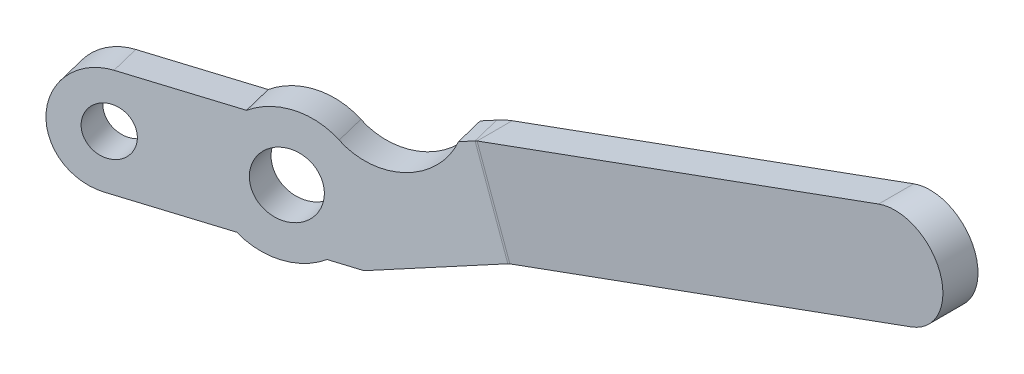
ISO-10303-21;
HEADER;
FILE_DESCRIPTION(('STEP AP214'),'2;1');
FILE_NAME('part.step','',(''),(''),'','','');
FILE_SCHEMA(('AUTOMOTIVE_DESIGN { 1 0 10303 214 1 1 1 1 }'));
ENDSEC;
DATA;
#1=APPLICATION_CONTEXT('core data for automotive mechanical design processes');
#2=APPLICATION_PROTOCOL_DEFINITION('international standard','automotive_design',2000,#1);
#3=PRODUCT_CONTEXT('',#1,'mechanical');
#4=PRODUCT('Part','Part','',(#3));
#5=PRODUCT_RELATED_PRODUCT_CATEGORY('part','',(#4));
#6=PRODUCT_DEFINITION_FORMATION('','',#4);
#7=PRODUCT_DEFINITION_CONTEXT('part definition',#1,'design');
#8=PRODUCT_DEFINITION('design','',#6,#7);
#9=PRODUCT_DEFINITION_SHAPE('','',#8);
#10=(LENGTH_UNIT() NAMED_UNIT(*) SI_UNIT(.MILLI.,.METRE.));
#11=(NAMED_UNIT(*) PLANE_ANGLE_UNIT() SI_UNIT($,.RADIAN.));
#12=(NAMED_UNIT(*) SI_UNIT($,.STERADIAN.) SOLID_ANGLE_UNIT());
#13=UNCERTAINTY_MEASURE_WITH_UNIT(LENGTH_MEASURE(1.E-05),#10,'distance_accuracy_value','');
#14=(GEOMETRIC_REPRESENTATION_CONTEXT(3) GLOBAL_UNCERTAINTY_ASSIGNED_CONTEXT((#13)) GLOBAL_UNIT_ASSIGNED_CONTEXT((#10,
#11,#12)) REPRESENTATION_CONTEXT('',''));
#15=CARTESIAN_POINT('',(0.,0.,0.));
#16=DIRECTION('',(0.,0.,1.));
#17=DIRECTION('',(1.,0.,0.));
#18=AXIS2_PLACEMENT_3D('',#15,#16,#17);
#19=CARTESIAN_POINT('',(16.9303405636724,10.0535875037622,-3.80139693251965));
#20=DIRECTION('',(-0.342020143325667,0.939692620785909,0.));
#21=DIRECTION('',(-0.883022221559487,-0.321393804843274,0.34202014332567));
#22=AXIS2_PLACEMENT_3D('',#19,#20,#21);
#23=PLANE('',#22);
#24=DIRECTION('',(-0.883022221559487,-0.321393804843274,0.34202014332567));
#25=VECTOR('',#24,1.);
#26=CARTESIAN_POINT('',(18.4601750747264,10.610401729139,0.671539942421267));
#27=LINE('',#26,#25);
#28=CARTESIAN_POINT('',(20.0792572328434,11.199699441525,0.0444224155291021));
#29=VERTEX_POINT('',#28);
#30=CARTESIAN_POINT('',(18.4601750747264,10.610401729139,0.671539942421267));
#31=VERTEX_POINT('',#30);
#32=EDGE_CURVE('E64',#29,#31,#27,.T.);
#33=ORIENTED_EDGE('',*,*,#32,.F.);
#34=DIRECTION('',(-0.321393804843275,-0.116977778440493,-0.939692620785909));
#35=VECTOR('',#34,1.);
#36=CARTESIAN_POINT('',(18.5494227217894,10.6428852161483,-4.42851445941182));
#37=LINE('',#36,#35);
#38=CARTESIAN_POINT('',(18.5494227217894,10.6428852161483,-4.42851445941182));
#39=VERTEX_POINT('',#38);
#40=EDGE_CURVE('E141',#29,#39,#37,.T.);
#41=ORIENTED_EDGE('',*,*,#40,.T.);
#42=DIRECTION('',(-0.883022221559487,-0.321393804843274,0.34202014332567));
#43=VECTOR('',#42,1.);
#44=CARTESIAN_POINT('',(16.9303405636724,10.0535875037622,-3.80139693251965));
#45=LINE('',#44,#43);
#46=CARTESIAN_POINT('',(16.9303405636724,10.0535875037622,-3.80139693251965));
#47=VERTEX_POINT('',#46);
#48=EDGE_CURVE('E44',#39,#47,#45,.T.);
#49=ORIENTED_EDGE('',*,*,#48,.T.);
#50=DIRECTION('',(0.321393804843277,0.116977778440494,0.939692620785908));
#51=VECTOR('',#50,1.);
#52=CARTESIAN_POINT('',(16.9303405636724,10.0535875037622,-3.80139693251965));
#53=LINE('',#52,#51);
#54=EDGE_CURVE('E269',#47,#31,#53,.T.);
#55=ORIENTED_EDGE('',*,*,#54,.T.);
#56=EDGE_LOOP('',(#33,#41,#49,#55));
#57=FACE_BOUND('',#56,.T.);
#58=ADVANCED_FACE('F40',(#57),#23,.T.);
#59=CARTESIAN_POINT('',(8.93069721890043,-6.69235560066744,1.01926349836034));
#60=DIRECTION('',(0.342020143325667,-0.939692620785909,0.));
#61=DIRECTION('',(0.883022221559487,0.321393804843274,-0.34202014332567));
#62=AXIS2_PLACEMENT_3D('',#59,#60,#61);
#63=PLANE('',#62);
#64=DIRECTION('',(0.883022221559487,0.321393804843274,-0.34202014332567));
#65=VECTOR('',#64,1.);
#66=CARTESIAN_POINT('',(8.93069721890043,-6.69235560066744,1.01926349836034));
#67=LINE('',#66,#65);
#68=CARTESIAN_POINT('',(8.93069721890043,-6.69235560066744,1.01926349836034));
#69=VERTEX_POINT('',#68);
#70=CARTESIAN_POINT('',(22.9956845850224,-1.57311885406876,-4.42851445941182));
#71=VERTEX_POINT('',#70);
#72=EDGE_CURVE('E160',#69,#71,#67,.T.);
#73=ORIENTED_EDGE('',*,*,#72,.T.);
#74=DIRECTION('',(0.321393804843275,0.116977778440493,0.939692620785909));
#75=VECTOR('',#74,1.);
#76=CARTESIAN_POINT('',(22.9956845850224,-1.57311885406875,-4.42851445941179));
#77=LINE('',#76,#75);
#78=CARTESIAN_POINT('',(24.5255190960764,-1.01630462869201,0.044422415529103));
#79=VERTEX_POINT('',#78);
#80=EDGE_CURVE('E12',#71,#79,#77,.T.);
#81=ORIENTED_EDGE('',*,*,#80,.T.);
#82=DIRECTION('',(0.883022221559487,0.321393804843274,-0.34202014332567));
#83=VECTOR('',#82,1.);
#84=CARTESIAN_POINT('',(10.4605317299544,-6.13554137529069,5.49220037330126));
#85=LINE('',#84,#83);
#86=CARTESIAN_POINT('',(10.4605317299544,-6.13554137529069,5.49220037330126));
#87=VERTEX_POINT('',#86);
#88=EDGE_CURVE('E57',#87,#79,#85,.T.);
#89=ORIENTED_EDGE('',*,*,#88,.F.);
#90=DIRECTION('',(0.321393804843277,0.116977778440494,0.939692620785908));
#91=VECTOR('',#90,1.);
#92=CARTESIAN_POINT('',(8.93069721890043,-6.69235560066744,1.01926349836034));
#93=LINE('',#92,#91);
#94=EDGE_CURVE('E271',#69,#87,#93,.T.);
#95=ORIENTED_EDGE('',*,*,#94,.F.);
#96=EDGE_LOOP('',(#73,#81,#89,#95));
#97=FACE_BOUND('',#96,.T.);
#98=ADVANCED_FACE('F42',(#97),#63,.T.);
#99=CARTESIAN_POINT('',(-15.9636675172793,1.10513464504574,13.6284521343767));
#100=DIRECTION('',(0.321393804843277,0.116977778440494,0.939692620785908));
#101=DIRECTION('',(0.94674724402994,-0.0193824180657404,-0.321393804843277));
#102=AXIS2_PLACEMENT_3D('',#99,#100,#101);
#103=PLANE('',#102);
#104=CARTESIAN_POINT('',(2.02453011928954,0.736868701796673,7.52196984235449));
#105=DIRECTION('',(0.321393804843277,0.116977778440494,0.939692620785908));
#106=DIRECTION('',(0.94674724402994,-0.0193824180657404,-0.321393804843277));
#107=AXIS2_PLACEMENT_3D('',#104,#105,#106);
#108=CIRCLE('',#107,4.);
#109=CARTESIAN_POINT('',(5.8115190954093,0.659339029533711,6.23639462298139));
#110=VERTEX_POINT('',#109);
#111=EDGE_CURVE('E190',#110,#110,#108,.T.);
#112=ORIENTED_EDGE('',*,*,#111,.F.);
#113=EDGE_LOOP('',(#112));
#114=FACE_BOUND('',#113,.T.);
#115=CARTESIAN_POINT('',(-15.9636675172793,1.10513464504574,13.6284521343767));
#116=DIRECTION('',(0.321393804843277,0.116977778440494,0.939692620785908));
#117=DIRECTION('',(0.94674724402994,-0.0193824180657404,-0.321393804843277));
#118=AXIS2_PLACEMENT_3D('',#115,#116,#117);
#119=CIRCLE('',#118,3.);
#120=CARTESIAN_POINT('',(-13.1234257851895,1.04698739084852,12.6642707198469));
#121=VERTEX_POINT('',#120);
#122=EDGE_CURVE('E216',#121,#121,#119,.T.);
#123=ORIENTED_EDGE('',*,*,#122,.F.);
#124=EDGE_LOOP('',(#123));
#125=FACE_BOUND('',#124,.T.);
#126=ORIENTED_EDGE('',*,*,#88,.T.);
#127=DIRECTION('',(-0.342020143325619,0.939692620785927,0.));
#128=VECTOR('',#127,1.);
#129=CARTESIAN_POINT('',(19.1073665552538,13.8699471323814,0.0444224155291047));
#130=LINE('',#129,#128);
#131=EDGE_CURVE('E49',#79,#29,#130,.T.);
#132=ORIENTED_EDGE('',*,*,#131,.T.);
#133=ORIENTED_EDGE('',*,*,#32,.T.);
#134=CARTESIAN_POINT('',(11.2425108575783,13.324299739666,2.80228648693524));
#135=DIRECTION('',(-0.321393804843277,-0.116977778440494,-0.939692620785908));
#136=DIRECTION('',(0.94674724402994,-0.0193824180657404,-0.321393804843277));
#137=AXIS2_PLACEMENT_3D('',#134,#135,#136);
#138=CIRCLE('',#137,8.);
#139=CARTESIAN_POINT('',(6.71834853203782,7.14641947568104,5.11869549572997));
#140=VERTEX_POINT('',#139);
#141=EDGE_CURVE('E256',#31,#140,#138,.T.);
#142=ORIENTED_EDGE('',*,*,#141,.T.);
#143=CARTESIAN_POINT('',(2.02453011928954,0.736868701796673,7.52196984235449));
#144=DIRECTION('',(0.321393804843277,0.116977778440494,0.939692620785908));
#145=DIRECTION('',(0.94674724402994,-0.0193824180657404,-0.321393804843277));
#146=AXIS2_PLACEMENT_3D('',#143,#144,#145);
#147=CIRCLE('',#146,8.3);
#148=CARTESIAN_POINT('',(-2.6789531795147,7.53286426506875,8.28465533576305));
#149=VERTEX_POINT('',#148);
#150=EDGE_CURVE('E259',#140,#149,#147,.T.);
#151=ORIENTED_EDGE('',*,*,#150,.T.);
#152=DIRECTION('',(-0.94674724402994,0.0193824180657404,0.321393804843277));
#153=VECTOR('',#152,1.);
#154=CARTESIAN_POINT('',(-16.0944988392231,7.80751593814853,12.8388521299034));
#155=LINE('',#154,#153);
#156=CARTESIAN_POINT('',(-16.0944988392231,7.80751593814853,12.8388521299034));
#157=VERTEX_POINT('',#156);
#158=EDGE_CURVE('E229',#149,#157,#155,.T.);
#159=ORIENTED_EDGE('',*,*,#158,.T.);
#160=CARTESIAN_POINT('',(-15.9636675172793,1.10513464504574,13.6284521343767));
#161=DIRECTION('',(0.321393804843277,0.116977778440494,0.939692620785908));
#162=DIRECTION('',(0.94674724402994,-0.0193824180657404,-0.321393804843277));
#163=AXIS2_PLACEMENT_3D('',#160,#161,#162);
#164=CIRCLE('',#163,6.75);
#165=CARTESIAN_POINT('',(-15.8328361953356,-5.59724664805705,14.4180521388501));
#166=VERTEX_POINT('',#165);
#167=EDGE_CURVE('E222',#157,#166,#164,.T.);
#168=ORIENTED_EDGE('',*,*,#167,.T.);
#169=DIRECTION('',(0.94674724402994,-0.0193824180657404,-0.321393804843277));
#170=VECTOR('',#169,1.);
#171=CARTESIAN_POINT('',(-15.8328361953356,-5.59724664805705,14.4180521388501));
#172=LINE('',#171,#170);
#173=CARTESIAN_POINT('',(-2.41729053562721,-5.87189832113683,9.86385534470972));
#174=VERTEX_POINT('',#173);
#175=EDGE_CURVE('E248',#166,#174,#172,.T.);
#176=ORIENTED_EDGE('',*,*,#175,.T.);
#177=CARTESIAN_POINT('',(2.02453011928954,0.736868701796673,7.52196984235449));
#178=DIRECTION('',(0.321393804843277,0.116977778440494,0.939692620785908));
#179=DIRECTION('',(0.94674724402994,-0.0193824180657404,-0.321393804843277));
#180=AXIS2_PLACEMENT_3D('',#177,#178,#179);
#181=CIRCLE('',#180,8.3);
#182=CARTESIAN_POINT('',(6.72801341809379,-6.0591268614754,6.75928434894593));
#183=VERTEX_POINT('',#182);
#184=EDGE_CURVE('E251',#174,#183,#181,.T.);
#185=ORIENTED_EDGE('',*,*,#184,.T.);
#186=DIRECTION('',(0.94674724402994,-0.0193824180657402,-0.321393804843277));
#187=VECTOR('',#186,1.);
#188=CARTESIAN_POINT('',(6.72801341809379,-6.0591268614754,6.75928434894593));
#189=LINE('',#188,#187);
#190=EDGE_CURVE('E254',#183,#87,#189,.T.);
#191=ORIENTED_EDGE('',*,*,#190,.T.);
#192=EDGE_LOOP('',(#126,#132,#133,#142,#151,#159,#168,#176,#185,#191));
#193=FACE_BOUND('',#192,.T.);
#194=ADVANCED_FACE('F280',(#114,#125,#193),#103,.T.);
#195=CARTESIAN_POINT('',(-17.4935020283333,0.54832041966899,9.15551525943583));
#196=DIRECTION('',(0.321393804843277,0.116977778440494,0.939692620785908));
#197=DIRECTION('',(0.94674724402994,-0.0193824180657404,-0.321393804843277));
#198=AXIS2_PLACEMENT_3D('',#195,#196,#197);
#199=CYLINDRICAL_SURFACE('',#198,6.75);
#200=ORIENTED_EDGE('',*,*,#167,.F.);
#201=DIRECTION('',(0.321393804843277,0.116977778440494,0.939692620785908));
#202=VECTOR('',#201,1.);
#203=CARTESIAN_POINT('',(-17.6243333502771,7.25070171277178,8.36591525496249));
#204=LINE('',#203,#202);
#205=CARTESIAN_POINT('',(-17.6243333502771,7.25070171277178,8.36591525496249));
#206=VERTEX_POINT('',#205);
#207=EDGE_CURVE('E169',#206,#157,#204,.T.);
#208=ORIENTED_EDGE('',*,*,#207,.F.);
#209=CARTESIAN_POINT('',(-17.4935020283333,0.54832041966899,9.15551525943583));
#210=DIRECTION('',(0.321393804843277,0.116977778440494,0.939692620785908));
#211=DIRECTION('',(0.94674724402994,-0.0193824180657404,-0.321393804843277));
#212=AXIS2_PLACEMENT_3D('',#209,#210,#211);
#213=CIRCLE('',#212,6.75);
#214=CARTESIAN_POINT('',(-17.3626707063896,-6.1540608734338,9.94511526390916));
#215=VERTEX_POINT('',#214);
#216=EDGE_CURVE('E225',#206,#215,#213,.T.);
#217=ORIENTED_EDGE('',*,*,#216,.T.);
#218=DIRECTION('',(0.321393804843277,0.116977778440494,0.939692620785908));
#219=VECTOR('',#218,1.);
#220=CARTESIAN_POINT('',(-17.3626707063896,-6.1540608734338,9.94511526390916));
#221=LINE('',#220,#219);
#222=EDGE_CURVE('E245',#215,#166,#221,.T.);
#223=ORIENTED_EDGE('',*,*,#222,.T.);
#224=EDGE_LOOP('',(#200,#208,#217,#223));
#225=FACE_BOUND('',#224,.T.);
#226=ADVANCED_FACE('F295',(#225),#199,.T.);
#227=CARTESIAN_POINT('',(-17.6243333502771,7.25070171277178,8.36591525496249));
#228=DIRECTION('',(-0.0193824180657404,0.992945376755968,-0.116977778440494));
#229=DIRECTION('',(0.321393804843277,0.116977778440494,0.939692620785908));
#230=AXIS2_PLACEMENT_3D('',#227,#228,#229);
#231=PLANE('',#230);
#232=ORIENTED_EDGE('',*,*,#158,.F.);
#233=DIRECTION('',(0.321393804843277,0.116977778440494,0.939692620785908));
#234=VECTOR('',#233,1.);
#235=CARTESIAN_POINT('',(-4.2087876905687,6.97605003969199,3.81171846082213));
#236=LINE('',#235,#234);
#237=CARTESIAN_POINT('',(-4.2087876905687,6.97605003969199,3.81171846082213));
#238=VERTEX_POINT('',#237);
#239=EDGE_CURVE('E265',#238,#149,#236,.T.);
#240=ORIENTED_EDGE('',*,*,#239,.F.);
#241=DIRECTION('',(-0.94674724402994,0.0193824180657404,0.321393804843277));
#242=VECTOR('',#241,1.);
#243=CARTESIAN_POINT('',(-17.6243333502771,7.25070171277178,8.36591525496249));
#244=LINE('',#243,#242);
#245=EDGE_CURVE('E242',#238,#206,#244,.T.);
#246=ORIENTED_EDGE('',*,*,#245,.T.);
#247=ORIENTED_EDGE('',*,*,#207,.T.);
#248=EDGE_LOOP('',(#232,#240,#246,#247));
#249=FACE_BOUND('',#248,.T.);
#250=ADVANCED_FACE('F290',(#249),#231,.T.);
#251=CARTESIAN_POINT('',(0.494695608235544,0.180054476419921,3.04903296741357));
#252=DIRECTION('',(0.321393804843277,0.116977778440494,0.939692620785908));
#253=DIRECTION('',(0.94674724402994,-0.0193824180657404,-0.321393804843277));
#254=AXIS2_PLACEMENT_3D('',#251,#252,#253);
#255=CYLINDRICAL_SURFACE('',#254,8.3);
#256=ORIENTED_EDGE('',*,*,#150,.F.);
#257=DIRECTION('',(0.321393804843277,0.116977778440494,0.939692620785908));
#258=VECTOR('',#257,1.);
#259=CARTESIAN_POINT('',(5.18851402098382,6.58960525030429,0.645758620789045));
#260=LINE('',#259,#258);
#261=CARTESIAN_POINT('',(5.18851402098382,6.58960525030429,0.645758620789045));
#262=VERTEX_POINT('',#261);
#263=EDGE_CURVE('E267',#262,#140,#260,.T.);
#264=ORIENTED_EDGE('',*,*,#263,.F.);
#265=CARTESIAN_POINT('',(0.494695608235544,0.180054476419921,3.04903296741357));
#266=DIRECTION('',(0.321393804843277,0.116977778440494,0.939692620785908));
#267=DIRECTION('',(0.94674724402994,-0.0193824180657404,-0.321393804843277));
#268=AXIS2_PLACEMENT_3D('',#265,#266,#267);
#269=CIRCLE('',#268,8.3);
#270=EDGE_CURVE('E239',#262,#238,#269,.T.);
#271=ORIENTED_EDGE('',*,*,#270,.T.);
#272=ORIENTED_EDGE('',*,*,#239,.T.);
#273=EDGE_LOOP('',(#256,#264,#271,#272));
#274=FACE_BOUND('',#273,.T.);
#275=ADVANCED_FACE('F287',(#274),#255,.T.);
#276=CARTESIAN_POINT('',(9.71267634652434,12.7674855142892,-1.67065038800568));
#277=DIRECTION('',(0.321393804843277,0.116977778440494,0.939692620785908));
#278=DIRECTION('',(0.94674724402994,-0.0193824180657404,-0.321393804843277));
#279=AXIS2_PLACEMENT_3D('',#276,#277,#278);
#280=CYLINDRICAL_SURFACE('',#279,8.);
#281=ORIENTED_EDGE('',*,*,#141,.F.);
#282=ORIENTED_EDGE('',*,*,#54,.F.);
#283=CARTESIAN_POINT('',(9.71267634652434,12.7674855142892,-1.67065038800568));
#284=DIRECTION('',(-0.321393804843277,-0.116977778440494,-0.939692620785908));
#285=DIRECTION('',(0.94674724402994,-0.0193824180657404,-0.321393804843277));
#286=AXIS2_PLACEMENT_3D('',#283,#284,#285);
#287=CIRCLE('',#286,8.);
#288=EDGE_CURVE('E159',#47,#262,#287,.T.);
#289=ORIENTED_EDGE('',*,*,#288,.T.);
#290=ORIENTED_EDGE('',*,*,#263,.T.);
#291=EDGE_LOOP('',(#281,#282,#289,#290));
#292=FACE_BOUND('',#291,.T.);
#293=ADVANCED_FACE('F284',(#292),#280,.F.);
#294=CARTESIAN_POINT('',(5.19817890703979,-6.61594108685215,2.28634747400501));
#295=DIRECTION('',(0.0193824180657407,-0.992945376755968,0.116977778440494));
#296=DIRECTION('',(0.94674724402994,-0.0193824180657402,-0.321393804843277));
#297=AXIS2_PLACEMENT_3D('',#294,#295,#296);
#298=PLANE('',#297);
#299=ORIENTED_EDGE('',*,*,#190,.F.);
#300=DIRECTION('',(0.321393804843277,0.116977778440494,0.939692620785908));
#301=VECTOR('',#300,1.);
#302=CARTESIAN_POINT('',(5.19817890703979,-6.61594108685215,2.28634747400501));
#303=LINE('',#302,#301);
#304=CARTESIAN_POINT('',(5.19817890703979,-6.61594108685215,2.28634747400501));
#305=VERTEX_POINT('',#304);
#306=EDGE_CURVE('E273',#305,#183,#303,.T.);
#307=ORIENTED_EDGE('',*,*,#306,.F.);
#308=DIRECTION('',(0.94674724402994,-0.0193824180657402,-0.321393804843277));
#309=VECTOR('',#308,1.);
#310=CARTESIAN_POINT('',(5.19817890703979,-6.61594108685215,2.28634747400501));
#311=LINE('',#310,#309);
#312=EDGE_CURVE('E235',#305,#69,#311,.T.);
#313=ORIENTED_EDGE('',*,*,#312,.T.);
#314=ORIENTED_EDGE('',*,*,#94,.T.);
#315=EDGE_LOOP('',(#299,#307,#313,#314));
#316=FACE_BOUND('',#315,.T.);
#317=ADVANCED_FACE('F307',(#316),#298,.T.);
#318=CARTESIAN_POINT('',(0.494695608235544,0.180054476419921,3.04903296741357));
#319=DIRECTION('',(0.321393804843277,0.116977778440494,0.939692620785908));
#320=DIRECTION('',(0.94674724402994,-0.0193824180657404,-0.321393804843277));
#321=AXIS2_PLACEMENT_3D('',#318,#319,#320);
#322=CYLINDRICAL_SURFACE('',#321,8.3);
#323=ORIENTED_EDGE('',*,*,#184,.F.);
#324=DIRECTION('',(0.321393804843277,0.116977778440494,0.939692620785908));
#325=VECTOR('',#324,1.);
#326=CARTESIAN_POINT('',(-3.94712504668121,-6.42871254651358,5.3909184697688));
#327=LINE('',#326,#325);
#328=CARTESIAN_POINT('',(-3.94712504668121,-6.42871254651358,5.3909184697688));
#329=VERTEX_POINT('',#328);
#330=EDGE_CURVE('E275',#329,#174,#327,.T.);
#331=ORIENTED_EDGE('',*,*,#330,.F.);
#332=CARTESIAN_POINT('',(0.494695608235544,0.180054476419921,3.04903296741357));
#333=DIRECTION('',(0.321393804843277,0.116977778440494,0.939692620785908));
#334=DIRECTION('',(0.94674724402994,-0.0193824180657404,-0.321393804843277));
#335=AXIS2_PLACEMENT_3D('',#332,#333,#334);
#336=CIRCLE('',#335,8.3);
#337=EDGE_CURVE('E232',#329,#305,#336,.T.);
#338=ORIENTED_EDGE('',*,*,#337,.T.);
#339=ORIENTED_EDGE('',*,*,#306,.T.);
#340=EDGE_LOOP('',(#323,#331,#338,#339));
#341=FACE_BOUND('',#340,.T.);
#342=ADVANCED_FACE('F303',(#341),#322,.T.);
#343=CARTESIAN_POINT('',(-17.3626707063896,-6.1540608734338,9.94511526390916));
#344=DIRECTION('',(0.0193824180657404,-0.992945376755968,0.116977778440494));
#345=DIRECTION('',(-0.321393804843277,-0.116977778440494,-0.939692620785908));
#346=AXIS2_PLACEMENT_3D('',#343,#344,#345);
#347=PLANE('',#346);
#348=ORIENTED_EDGE('',*,*,#175,.F.);
#349=ORIENTED_EDGE('',*,*,#222,.F.);
#350=DIRECTION('',(0.94674724402994,-0.0193824180657404,-0.321393804843277));
#351=VECTOR('',#350,1.);
#352=CARTESIAN_POINT('',(-17.3626707063896,-6.1540608734338,9.94511526390916));
#353=LINE('',#352,#351);
#354=EDGE_CURVE('E228',#215,#329,#353,.T.);
#355=ORIENTED_EDGE('',*,*,#354,.T.);
#356=ORIENTED_EDGE('',*,*,#330,.T.);
#357=EDGE_LOOP('',(#348,#349,#355,#356));
#358=FACE_BOUND('',#357,.T.);
#359=ADVANCED_FACE('F299',(#358),#347,.T.);
#360=CARTESIAN_POINT('',(-17.4935020283333,0.54832041966899,9.15551525943583));
#361=DIRECTION('',(0.321393804843277,0.116977778440494,0.939692620785908));
#362=DIRECTION('',(0.94674724402994,-0.0193824180657404,-0.321393804843277));
#363=AXIS2_PLACEMENT_3D('',#360,#361,#362);
#364=PLANE('',#363);
#365=DIRECTION('',(-0.342020143325619,0.939692620785927,0.));
#366=VECTOR('',#365,1.);
#367=CARTESIAN_POINT('',(17.5775320441998,13.3131329070047,-4.42851445941182));
#368=LINE('',#367,#366);
#369=EDGE_CURVE('E148',#71,#39,#368,.T.);
#370=ORIENTED_EDGE('',*,*,#369,.F.);
#371=ORIENTED_EDGE('',*,*,#72,.F.);
#372=ORIENTED_EDGE('',*,*,#312,.F.);
#373=ORIENTED_EDGE('',*,*,#337,.F.);
#374=ORIENTED_EDGE('',*,*,#354,.F.);
#375=ORIENTED_EDGE('',*,*,#216,.F.);
#376=ORIENTED_EDGE('',*,*,#245,.F.);
#377=ORIENTED_EDGE('',*,*,#270,.F.);
#378=ORIENTED_EDGE('',*,*,#288,.F.);
#379=ORIENTED_EDGE('',*,*,#48,.F.);
#380=EDGE_LOOP('',(#370,#371,#372,#373,#374,#375,#376,#377,#378,#379));
#381=FACE_BOUND('',#380,.T.);
#382=CARTESIAN_POINT('',(0.494695608235544,0.180054476419921,3.04903296741357));
#383=DIRECTION('',(0.321393804843277,0.116977778440494,0.939692620785908));
#384=DIRECTION('',(0.94674724402994,-0.0193824180657404,-0.321393804843277));
#385=AXIS2_PLACEMENT_3D('',#382,#383,#384);
#386=CIRCLE('',#385,4.);
#387=CARTESIAN_POINT('',(4.2816845843553,0.102524804156959,1.76345774804046));
#388=VERTEX_POINT('',#387);
#389=EDGE_CURVE('E213',#388,#388,#386,.T.);
#390=ORIENTED_EDGE('',*,*,#389,.T.);
#391=EDGE_LOOP('',(#390));
#392=FACE_BOUND('',#391,.T.);
#393=CARTESIAN_POINT('',(-17.4935020283333,0.54832041966899,9.15551525943583));
#394=DIRECTION('',(0.321393804843277,0.116977778440494,0.939692620785908));
#395=DIRECTION('',(0.94674724402994,-0.0193824180657404,-0.321393804843277));
#396=AXIS2_PLACEMENT_3D('',#393,#394,#395);
#397=CIRCLE('',#396,3.);
#398=CARTESIAN_POINT('',(-14.6532602962435,0.490173165471768,8.191333844906));
#399=VERTEX_POINT('',#398);
#400=EDGE_CURVE('E219',#399,#399,#397,.T.);
#401=ORIENTED_EDGE('',*,*,#400,.T.);
#402=EDGE_LOOP('',(#401));
#403=FACE_BOUND('',#402,.T.);
#404=ADVANCED_FACE('F153',(#381,#392,#403),#364,.F.);
#405=CARTESIAN_POINT('',(-17.4935020283333,0.54832041966899,9.15551525943583));
#406=DIRECTION('',(0.321393804843277,0.116977778440494,0.939692620785908));
#407=DIRECTION('',(0.94674724402994,-0.0193824180657404,-0.321393804843277));
#408=AXIS2_PLACEMENT_3D('',#405,#406,#407);
#409=CYLINDRICAL_SURFACE('',#408,3.);
#410=ORIENTED_EDGE('',*,*,#400,.F.);
#411=EDGE_LOOP('',(#410));
#412=FACE_BOUND('',#411,.T.);
#413=ORIENTED_EDGE('',*,*,#122,.T.);
#414=EDGE_LOOP('',(#413));
#415=FACE_BOUND('',#414,.T.);
#416=ADVANCED_FACE('F340',(#412,#415),#409,.F.);
#417=CARTESIAN_POINT('',(0.494695608235544,0.180054476419921,3.04903296741357));
#418=DIRECTION('',(0.321393804843277,0.116977778440494,0.939692620785908));
#419=DIRECTION('',(0.94674724402994,-0.0193824180657404,-0.321393804843277));
#420=AXIS2_PLACEMENT_3D('',#417,#418,#419);
#421=CYLINDRICAL_SURFACE('',#420,4.);
#422=ORIENTED_EDGE('',*,*,#389,.F.);
#423=EDGE_LOOP('',(#422));
#424=FACE_BOUND('',#423,.T.);
#425=ORIENTED_EDGE('',*,*,#111,.T.);
#426=EDGE_LOOP('',(#425));
#427=FACE_BOUND('',#426,.T.);
#428=ADVANCED_FACE('F333',(#424,#427),#421,.F.);
#429=CARTESIAN_POINT('',(77.,25.,-4.76));
#430=DIRECTION('',(0.,0.,1.));
#431=DIRECTION('',(1.,0.,0.));
#432=AXIS2_PLACEMENT_3D('',#429,#430,#431);
#433=CYLINDRICAL_SURFACE('',#432,6.5);
#434=CARTESIAN_POINT('',(77.,25.,0.));
#435=DIRECTION('',(0.,0.,1.));
#436=DIRECTION('',(1.,0.,0.));
#437=AXIS2_PLACEMENT_3D('',#434,#435,#436);
#438=CIRCLE('',#437,6.5);
#439=CARTESIAN_POINT('',(79.2231309316169,18.8919979648916,0.));
#440=VERTEX_POINT('',#439);
#441=CARTESIAN_POINT('',(74.7768690683831,31.1080020351084,0.));
#442=VERTEX_POINT('',#441);
#443=EDGE_CURVE('E195',#440,#442,#438,.T.);
#444=ORIENTED_EDGE('',*,*,#443,.F.);
#445=DIRECTION('',(0.,0.,1.));
#446=VECTOR('',#445,1.);
#447=CARTESIAN_POINT('',(79.2231309316169,18.8919979648916,-4.76));
#448=LINE('',#447,#446);
#449=CARTESIAN_POINT('',(79.2231309316169,18.8919979648916,-4.76));
#450=VERTEX_POINT('',#449);
#451=EDGE_CURVE('E187',#450,#440,#448,.T.);
#452=ORIENTED_EDGE('',*,*,#451,.F.);
#453=CARTESIAN_POINT('',(77.,25.,-4.76));
#454=DIRECTION('',(0.,0.,1.));
#455=DIRECTION('',(1.,0.,0.));
#456=AXIS2_PLACEMENT_3D('',#453,#454,#455);
#457=CIRCLE('',#456,6.5);
#458=CARTESIAN_POINT('',(74.7768690683831,31.1080020351084,-4.76));
#459=VERTEX_POINT('',#458);
#460=EDGE_CURVE('E207',#450,#459,#457,.T.);
#461=ORIENTED_EDGE('',*,*,#460,.T.);
#462=DIRECTION('',(0.,0.,1.));
#463=VECTOR('',#462,1.);
#464=CARTESIAN_POINT('',(74.7768690683831,31.1080020351084,-4.76));
#465=LINE('',#464,#463);
#466=EDGE_CURVE('E205',#459,#442,#465,.T.);
#467=ORIENTED_EDGE('',*,*,#466,.T.);
#468=EDGE_LOOP('',(#444,#452,#461,#467));
#469=FACE_BOUND('',#468,.T.);
#470=ADVANCED_FACE('F331',(#469),#433,.T.);
#471=CARTESIAN_POINT('',(-19.,0.,-4.76));
#472=DIRECTION('',(0.,0.,1.));
#473=DIRECTION('',(1.,0.,0.));
#474=AXIS2_PLACEMENT_3D('',#471,#472,#473);
#475=PLANE('',#474);
#476=DIRECTION('',(0.939692620785908,0.34202014332567,0.));
#477=VECTOR('',#476,1.);
#478=CARTESIAN_POINT('',(8.77232053337616,-6.75,-4.76));
#479=LINE('',#478,#477);
#480=CARTESIAN_POINT('',(24.762257772724,-0.930138797092681,-4.76));
#481=VERTEX_POINT('',#480);
#482=EDGE_CURVE('E191',#481,#450,#479,.T.);
#483=ORIENTED_EDGE('',*,*,#482,.F.);
#484=DIRECTION('',(-0.342020143325618,0.939692620785927,0.));
#485=VECTOR('',#484,1.);
#486=CARTESIAN_POINT('',(19.3441052319013,13.9561129639807,-4.76));
#487=LINE('',#486,#485);
#488=CARTESIAN_POINT('',(20.3159959094909,11.2858652731244,-4.76));
#489=VERTEX_POINT('',#488);
#490=EDGE_CURVE('E202',#481,#489,#487,.T.);
#491=ORIENTED_EDGE('',*,*,#490,.T.);
#492=DIRECTION('',(-0.939692620785908,-0.34202014332567,0.));
#493=VECTOR('',#492,1.);
#494=CARTESIAN_POINT('',(17.5707143508443,10.2866645010971,-4.76));
#495=LINE('',#494,#493);
#496=EDGE_CURVE('E200',#459,#489,#495,.T.);
#497=ORIENTED_EDGE('',*,*,#496,.F.);
#498=ORIENTED_EDGE('',*,*,#460,.F.);
#499=EDGE_LOOP('',(#483,#491,#497,#498));
#500=FACE_BOUND('',#499,.T.);
#501=ADVANCED_FACE('F329',(#500),#475,.F.);
#502=CARTESIAN_POINT('',(17.5707143508443,10.2866645010971,-4.76));
#503=DIRECTION('',(-0.34202014332567,0.939692620785908,0.));
#504=DIRECTION('',(-0.939692620785908,-0.34202014332567,0.));
#505=AXIS2_PLACEMENT_3D('',#502,#503,#504);
#506=PLANE('',#505);
#507=DIRECTION('',(0.,0.,-1.));
#508=VECTOR('',#507,1.);
#509=CARTESIAN_POINT('',(20.3159959094909,11.2858652731244,-4.75999999999999));
#510=LINE('',#509,#508);
#511=CARTESIAN_POINT('',(20.3159959094909,11.2858652731244,0.));
#512=VERTEX_POINT('',#511);
#513=EDGE_CURVE('E174',#512,#489,#510,.T.);
#514=ORIENTED_EDGE('',*,*,#513,.F.);
#515=DIRECTION('',(-0.939692620785908,-0.34202014332567,0.));
#516=VECTOR('',#515,1.);
#517=CARTESIAN_POINT('',(17.5707143508443,10.2866645010971,0.));
#518=LINE('',#517,#516);
#519=EDGE_CURVE('E193',#442,#512,#518,.T.);
#520=ORIENTED_EDGE('',*,*,#519,.F.);
#521=ORIENTED_EDGE('',*,*,#466,.F.);
#522=ORIENTED_EDGE('',*,*,#496,.T.);
#523=EDGE_LOOP('',(#514,#520,#521,#522));
#524=FACE_BOUND('',#523,.T.);
#525=ADVANCED_FACE('F325',(#524),#506,.T.);
#526=CARTESIAN_POINT('',(-19.,0.,0.));
#527=DIRECTION('',(0.,0.,1.));
#528=DIRECTION('',(1.,0.,0.));
#529=AXIS2_PLACEMENT_3D('',#526,#527,#528);
#530=PLANE('',#529);
#531=DIRECTION('',(-0.342020143325618,0.939692620785927,0.));
#532=VECTOR('',#531,1.);
#533=CARTESIAN_POINT('',(19.3441052319013,13.9561129639807,0.));
#534=LINE('',#533,#532);
#535=CARTESIAN_POINT('',(24.7622577727239,-0.930138797092687,0.));
#536=VERTEX_POINT('',#535);
#537=EDGE_CURVE('E178',#536,#512,#534,.T.);
#538=ORIENTED_EDGE('',*,*,#537,.F.);
#539=DIRECTION('',(0.939692620785908,0.34202014332567,0.));
#540=VECTOR('',#539,1.);
#541=CARTESIAN_POINT('',(8.77232053337616,-6.75,0.));
#542=LINE('',#541,#540);
#543=EDGE_CURVE('E198',#536,#440,#542,.T.);
#544=ORIENTED_EDGE('',*,*,#543,.T.);
#545=ORIENTED_EDGE('',*,*,#443,.T.);
#546=ORIENTED_EDGE('',*,*,#519,.T.);
#547=EDGE_LOOP('',(#538,#544,#545,#546));
#548=FACE_BOUND('',#547,.T.);
#549=ADVANCED_FACE('F322',(#548),#530,.T.);
#550=CARTESIAN_POINT('',(8.77232053337616,-6.75,-4.76));
#551=DIRECTION('',(0.34202014332567,-0.939692620785908,0.));
#552=DIRECTION('',(0.939692620785908,0.34202014332567,0.));
#553=AXIS2_PLACEMENT_3D('',#550,#551,#552);
#554=PLANE('',#553);
#555=DIRECTION('',(0.,0.,1.));
#556=VECTOR('',#555,1.);
#557=CARTESIAN_POINT('',(24.762257772724,-0.93013879709268,-4.75999999999996));
#558=LINE('',#557,#556);
#559=EDGE_CURVE('E175',#481,#536,#558,.T.);
#560=ORIENTED_EDGE('',*,*,#559,.F.);
#561=ORIENTED_EDGE('',*,*,#482,.T.);
#562=ORIENTED_EDGE('',*,*,#451,.T.);
#563=ORIENTED_EDGE('',*,*,#543,.F.);
#564=EDGE_LOOP('',(#560,#561,#562,#563));
#565=FACE_BOUND('',#564,.T.);
#566=ADVANCED_FACE('F317',(#565),#554,.T.);
#567=CARTESIAN_POINT('',(24.762257772724,-0.93013879709274,0.7366));
#568=DIRECTION('',(0.342020143325643,-0.939692620785918,0.));
#569=DIRECTION('',(0.939692620785918,0.342020143325643,0.));
#570=AXIS2_PLACEMENT_3D('',#567,#568,#569);
#571=PLANE('',#570);
#572=ORIENTED_EDGE('',*,*,#559,.T.);
#573=CARTESIAN_POINT('',(24.762257772724,-0.930138797092693,0.7366));
#574=DIRECTION('',(-0.342020143325618,0.939692620785927,0.));
#575=DIRECTION('',(-0.939692620785927,-0.342020143325618,0.));
#576=AXIS2_PLACEMENT_3D('',#573,#574,#575);
#577=CIRCLE('',#576,0.7366);
#578=EDGE_CURVE('E184',#536,#79,#577,.T.);
#579=ORIENTED_EDGE('',*,*,#578,.T.);
#580=ORIENTED_EDGE('',*,*,#80,.F.);
#581=CARTESIAN_POINT('',(24.762257772724,-0.93013879709274,0.7366));
#582=DIRECTION('',(-0.342020143325643,0.939692620785918,0.));
#583=DIRECTION('',(0.939692620785918,0.342020143325643,0.));
#584=AXIS2_PLACEMENT_3D('',#581,#582,#583);
#585=CIRCLE('',#584,5.4966);
#586=EDGE_CURVE('E168',#481,#71,#585,.T.);
#587=ORIENTED_EDGE('',*,*,#586,.F.);
#588=EDGE_LOOP('',(#572,#579,#580,#587));
#589=FACE_BOUND('',#588,.T.);
#590=ADVANCED_FACE('F314',(#589),#571,.T.);
#591=CARTESIAN_POINT('',(20.3159959094909,11.2858652731244,0.7366));
#592=DIRECTION('',(-0.342020143325671,0.939692620785908,0.));
#593=DIRECTION('',(-0.939692620785908,-0.342020143325671,0.));
#594=AXIS2_PLACEMENT_3D('',#591,#592,#593);
#595=PLANE('',#594);
#596=ORIENTED_EDGE('',*,*,#40,.F.);
#597=CARTESIAN_POINT('',(20.3159959094909,11.2858652731243,0.7366));
#598=DIRECTION('',(-0.342020143325618,0.939692620785927,0.));
#599=DIRECTION('',(-0.939692620785927,-0.342020143325618,0.));
#600=AXIS2_PLACEMENT_3D('',#597,#598,#599);
#601=CIRCLE('',#600,0.7366);
#602=EDGE_CURVE('E180',#29,#512,#601,.F.);
#603=ORIENTED_EDGE('',*,*,#602,.T.);
#604=ORIENTED_EDGE('',*,*,#513,.T.);
#605=CARTESIAN_POINT('',(20.3159959094909,11.2858652731244,0.7366));
#606=DIRECTION('',(0.342020143325671,-0.939692620785908,0.));
#607=DIRECTION('',(-0.939692620785908,-0.342020143325671,0.));
#608=AXIS2_PLACEMENT_3D('',#605,#606,#607);
#609=CIRCLE('',#608,5.4966);
#610=EDGE_CURVE('E166',#39,#489,#609,.T.);
#611=ORIENTED_EDGE('',*,*,#610,.F.);
#612=EDGE_LOOP('',(#596,#603,#604,#611));
#613=FACE_BOUND('',#612,.T.);
#614=ADVANCED_FACE('F172',(#613),#595,.T.);
#615=CARTESIAN_POINT('',(27.5075225131725,-8.47269168190131,0.7366));
#616=DIRECTION('',(-0.342020143325618,0.939692620785927,0.));
#617=DIRECTION('',(-0.939692620785927,-0.342020143325618,0.));
#618=AXIS2_PLACEMENT_3D('',#615,#616,#617);
#619=CYLINDRICAL_SURFACE('',#618,5.4966);
#620=ORIENTED_EDGE('',*,*,#610,.T.);
#621=ORIENTED_EDGE('',*,*,#490,.F.);
#622=ORIENTED_EDGE('',*,*,#586,.T.);
#623=ORIENTED_EDGE('',*,*,#369,.T.);
#624=EDGE_LOOP('',(#620,#621,#622,#623));
#625=FACE_BOUND('',#624,.T.);
#626=ADVANCED_FACE('F164',(#625),#619,.T.);
#627=CARTESIAN_POINT('',(27.5075225131725,-8.47269168190131,0.7366));
#628=DIRECTION('',(-0.342020143325618,0.939692620785927,0.));
#629=DIRECTION('',(-0.939692620785927,-0.342020143325618,0.));
#630=AXIS2_PLACEMENT_3D('',#627,#628,#629);
#631=CYLINDRICAL_SURFACE('',#630,0.7366);
#632=ORIENTED_EDGE('',*,*,#602,.F.);
#633=ORIENTED_EDGE('',*,*,#131,.F.);
#634=ORIENTED_EDGE('',*,*,#578,.F.);
#635=ORIENTED_EDGE('',*,*,#537,.T.);
#636=EDGE_LOOP('',(#632,#633,#634,#635));
#637=FACE_BOUND('',#636,.T.);
#638=ADVANCED_FACE('F313',(#637),#631,.F.);
#639=CLOSED_SHELL('',(#58,#98,#194,#226,#250,#275,#293,#317,#342,#359,#404,#416,#428,#470,#501,
#525,#549,#566,#590,#614,#626,#638));
#640=MANIFOLD_SOLID_BREP('B2',#639);
#641=ADVANCED_BREP_SHAPE_REPRESENTATION('',(#18,#640),#14);
#642=SHAPE_DEFINITION_REPRESENTATION(#9,#641);
ENDSEC;
END-ISO-10303-21;
